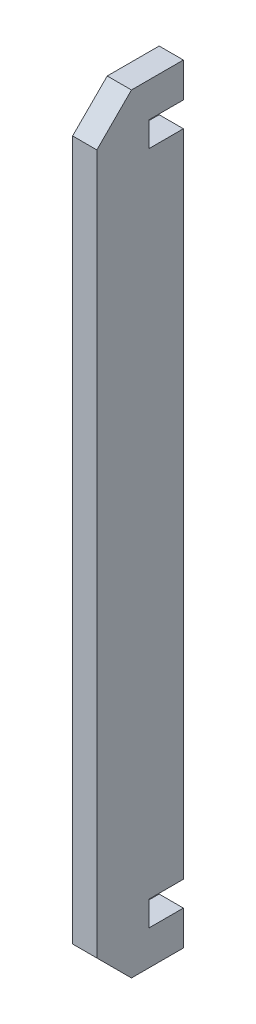
ISO-10303-21;
HEADER;
FILE_DESCRIPTION(('STEP AP214'),'2;1');
FILE_NAME('part.step','',(''),(''),'','','');
FILE_SCHEMA(('AUTOMOTIVE_DESIGN { 1 0 10303 214 1 1 1 1 }'));
ENDSEC;
DATA;
#1=APPLICATION_CONTEXT('core data for automotive mechanical design processes');
#2=APPLICATION_PROTOCOL_DEFINITION('international standard','automotive_design',2000,#1);
#3=PRODUCT_CONTEXT('',#1,'mechanical');
#4=PRODUCT('Part','Part','',(#3));
#5=PRODUCT_RELATED_PRODUCT_CATEGORY('part','',(#4));
#6=PRODUCT_DEFINITION_FORMATION('','',#4);
#7=PRODUCT_DEFINITION_CONTEXT('part definition',#1,'design');
#8=PRODUCT_DEFINITION('design','',#6,#7);
#9=PRODUCT_DEFINITION_SHAPE('','',#8);
#10=(LENGTH_UNIT() NAMED_UNIT(*) SI_UNIT(.MILLI.,.METRE.));
#11=(NAMED_UNIT(*) PLANE_ANGLE_UNIT() SI_UNIT($,.RADIAN.));
#12=(NAMED_UNIT(*) SI_UNIT($,.STERADIAN.) SOLID_ANGLE_UNIT());
#13=UNCERTAINTY_MEASURE_WITH_UNIT(LENGTH_MEASURE(1.E-05),#10,'distance_accuracy_value','');
#14=(GEOMETRIC_REPRESENTATION_CONTEXT(3) GLOBAL_UNCERTAINTY_ASSIGNED_CONTEXT((#13)) GLOBAL_UNIT_ASSIGNED_CONTEXT((#10,
#11,#12)) REPRESENTATION_CONTEXT('',''));
#15=CARTESIAN_POINT('',(0.,0.,0.));
#16=DIRECTION('',(0.,0.,1.));
#17=DIRECTION('',(1.,0.,0.));
#18=AXIS2_PLACEMENT_3D('',#15,#16,#17);
#19=CARTESIAN_POINT('',(3.5,0.,0.223880597014872));
#20=DIRECTION('',(0.,0.,1.));
#21=DIRECTION('',(0.,-1.,0.));
#22=AXIS2_PLACEMENT_3D('',#19,#20,#21);
#23=PLANE('',#22);
#24=DIRECTION('',(0.,1.,0.));
#25=VECTOR('',#24,1.);
#26=CARTESIAN_POINT('',(0.,0.,0.223880597014872));
#27=LINE('',#26,#25);
#28=CARTESIAN_POINT('',(0.,-17.9216417910448,0.223880597014868));
#29=VERTEX_POINT('',#28);
#30=CARTESIAN_POINT('',(0.,75.9783582089552,0.22388059701489));
#31=VERTEX_POINT('',#30);
#32=EDGE_CURVE('E178',#29,#31,#27,.T.);
#33=ORIENTED_EDGE('',*,*,#32,.T.);
#34=DIRECTION('',(-1.,0.,0.));
#35=VECTOR('',#34,1.);
#36=CARTESIAN_POINT('',(3.5,75.9783582089552,0.22388059701489));
#37=LINE('',#36,#35);
#38=CARTESIAN_POINT('',(3.5,75.9783582089552,0.22388059701489));
#39=VERTEX_POINT('',#38);
#40=EDGE_CURVE('E161',#39,#31,#37,.T.);
#41=ORIENTED_EDGE('',*,*,#40,.F.);
#42=DIRECTION('',(0.,1.,0.));
#43=VECTOR('',#42,1.);
#44=CARTESIAN_POINT('',(3.5,0.,0.223880597014872));
#45=LINE('',#44,#43);
#46=CARTESIAN_POINT('',(3.5,-17.9216417910448,0.223880597014868));
#47=VERTEX_POINT('',#46);
#48=EDGE_CURVE('E167',#47,#39,#45,.T.);
#49=ORIENTED_EDGE('',*,*,#48,.F.);
#50=DIRECTION('',(-1.,0.,0.));
#51=VECTOR('',#50,1.);
#52=CARTESIAN_POINT('',(3.5,-17.9216417910448,0.223880597014868));
#53=LINE('',#52,#51);
#54=EDGE_CURVE('E234',#47,#29,#53,.T.);
#55=ORIENTED_EDGE('',*,*,#54,.T.);
#56=EDGE_LOOP('',(#33,#41,#49,#55));
#57=FACE_BOUND('',#56,.T.);
#58=ADVANCED_FACE('F51',(#57),#23,.F.);
#59=CARTESIAN_POINT('',(3.5,75.9783582089552,0.));
#60=DIRECTION('',(0.,-1.,0.));
#61=DIRECTION('',(0.,0.,-1.));
#62=AXIS2_PLACEMENT_3D('',#59,#60,#61);
#63=PLANE('',#62);
#64=DIRECTION('',(0.,0.,1.));
#65=VECTOR('',#64,1.);
#66=CARTESIAN_POINT('',(0.,75.9783582089552,0.));
#67=LINE('',#66,#65);
#68=CARTESIAN_POINT('',(0.,75.9783582089552,5.22388059701566));
#69=VERTEX_POINT('',#68);
#70=EDGE_CURVE('E261',#31,#69,#67,.T.);
#71=ORIENTED_EDGE('',*,*,#70,.T.);
#72=DIRECTION('',(-1.,0.,0.));
#73=VECTOR('',#72,1.);
#74=CARTESIAN_POINT('',(3.5,75.9783582089552,5.22388059701566));
#75=LINE('',#74,#73);
#76=CARTESIAN_POINT('',(3.5,75.9783582089552,5.22388059701566));
#77=VERTEX_POINT('',#76);
#78=EDGE_CURVE('E164',#77,#69,#75,.T.);
#79=ORIENTED_EDGE('',*,*,#78,.F.);
#80=DIRECTION('',(0.,0.,1.));
#81=VECTOR('',#80,1.);
#82=CARTESIAN_POINT('',(3.5,75.9783582089552,0.));
#83=LINE('',#82,#81);
#84=EDGE_CURVE('E157',#39,#77,#83,.T.);
#85=ORIENTED_EDGE('',*,*,#84,.F.);
#86=ORIENTED_EDGE('',*,*,#40,.T.);
#87=EDGE_LOOP('',(#71,#79,#85,#86));
#88=FACE_BOUND('',#87,.T.);
#89=ADVANCED_FACE('F159',(#88),#63,.F.);
#90=CARTESIAN_POINT('',(3.5,0.,5.22388059701521));
#91=DIRECTION('',(0.,0.,1.));
#92=DIRECTION('',(0.,-1.,0.));
#93=AXIS2_PLACEMENT_3D('',#90,#91,#92);
#94=PLANE('',#93);
#95=DIRECTION('',(0.,1.,0.));
#96=VECTOR('',#95,1.);
#97=CARTESIAN_POINT('',(0.,0.,5.22388059701521));
#98=LINE('',#97,#96);
#99=CARTESIAN_POINT('',(0.,79.5783582089552,5.22388059701491));
#100=VERTEX_POINT('',#99);
#101=EDGE_CURVE('E259',#69,#100,#98,.T.);
#102=ORIENTED_EDGE('',*,*,#101,.T.);
#103=DIRECTION('',(-1.,0.,0.));
#104=VECTOR('',#103,1.);
#105=CARTESIAN_POINT('',(3.5,79.5783582089552,5.22388059701491));
#106=LINE('',#105,#104);
#107=CARTESIAN_POINT('',(3.5,79.5783582089552,5.22388059701491));
#108=VERTEX_POINT('',#107);
#109=EDGE_CURVE('E183',#108,#100,#106,.T.);
#110=ORIENTED_EDGE('',*,*,#109,.F.);
#111=DIRECTION('',(0.,1.,0.));
#112=VECTOR('',#111,1.);
#113=CARTESIAN_POINT('',(3.5,0.,5.22388059701521));
#114=LINE('',#113,#112);
#115=EDGE_CURVE('E166',#77,#108,#114,.T.);
#116=ORIENTED_EDGE('',*,*,#115,.F.);
#117=ORIENTED_EDGE('',*,*,#78,.T.);
#118=EDGE_LOOP('',(#102,#110,#116,#117));
#119=FACE_BOUND('',#118,.T.);
#120=ADVANCED_FACE('F260',(#119),#94,.F.);
#121=CARTESIAN_POINT('',(3.5,79.5783582089552,0.));
#122=DIRECTION('',(0.,-1.,0.));
#123=DIRECTION('',(0.,0.,-1.));
#124=AXIS2_PLACEMENT_3D('',#121,#122,#123);
#125=PLANE('',#124);
#126=DIRECTION('',(0.,0.,1.));
#127=VECTOR('',#126,1.);
#128=CARTESIAN_POINT('',(0.,79.5783582089552,0.));
#129=LINE('',#128,#127);
#130=CARTESIAN_POINT('',(0.,79.5783582089552,0.22388059701489));
#131=VERTEX_POINT('',#130);
#132=EDGE_CURVE('E222',#131,#100,#129,.T.);
#133=ORIENTED_EDGE('',*,*,#132,.F.);
#134=DIRECTION('',(-1.,0.,0.));
#135=VECTOR('',#134,1.);
#136=CARTESIAN_POINT('',(3.5,79.5783582089552,0.22388059701489));
#137=LINE('',#136,#135);
#138=CARTESIAN_POINT('',(3.5,79.5783582089552,0.22388059701489));
#139=VERTEX_POINT('',#138);
#140=EDGE_CURVE('E247',#139,#131,#137,.T.);
#141=ORIENTED_EDGE('',*,*,#140,.F.);
#142=DIRECTION('',(0.,0.,1.));
#143=VECTOR('',#142,1.);
#144=CARTESIAN_POINT('',(3.5,79.5783582089552,0.));
#145=LINE('',#144,#143);
#146=EDGE_CURVE('E256',#139,#108,#145,.T.);
#147=ORIENTED_EDGE('',*,*,#146,.T.);
#148=ORIENTED_EDGE('',*,*,#109,.T.);
#149=EDGE_LOOP('',(#133,#141,#147,#148));
#150=FACE_BOUND('',#149,.T.);
#151=ADVANCED_FACE('F253',(#150),#125,.T.);
#152=CARTESIAN_POINT('',(3.5,0.,0.223880597014872));
#153=DIRECTION('',(0.,0.,1.));
#154=DIRECTION('',(0.,-1.,0.));
#155=AXIS2_PLACEMENT_3D('',#152,#153,#154);
#156=PLANE('',#155);
#157=DIRECTION('',(0.,1.,0.));
#158=VECTOR('',#157,1.);
#159=CARTESIAN_POINT('',(0.,0.,0.223880597014872));
#160=LINE('',#159,#158);
#161=CARTESIAN_POINT('',(0.,84.5783582089552,0.223880597014892));
#162=VERTEX_POINT('',#161);
#163=EDGE_CURVE('E218',#131,#162,#160,.T.);
#164=ORIENTED_EDGE('',*,*,#163,.T.);
#165=DIRECTION('',(-1.,0.,0.));
#166=VECTOR('',#165,1.);
#167=CARTESIAN_POINT('',(3.5,84.5783582089552,0.223880597014892));
#168=LINE('',#167,#166);
#169=CARTESIAN_POINT('',(3.5,84.5783582089552,0.223880597014892));
#170=VERTEX_POINT('',#169);
#171=EDGE_CURVE('E217',#170,#162,#168,.T.);
#172=ORIENTED_EDGE('',*,*,#171,.F.);
#173=DIRECTION('',(0.,1.,0.));
#174=VECTOR('',#173,1.);
#175=CARTESIAN_POINT('',(3.5,0.,0.223880597014872));
#176=LINE('',#175,#174);
#177=EDGE_CURVE('E273',#139,#170,#176,.T.);
#178=ORIENTED_EDGE('',*,*,#177,.F.);
#179=ORIENTED_EDGE('',*,*,#140,.T.);
#180=EDGE_LOOP('',(#164,#172,#178,#179));
#181=FACE_BOUND('',#180,.T.);
#182=ADVANCED_FACE('F321',(#181),#156,.F.);
#183=CARTESIAN_POINT('',(3.5,84.5783582089552,0.));
#184=DIRECTION('',(0.,-1.,0.));
#185=DIRECTION('',(0.,0.,-1.));
#186=AXIS2_PLACEMENT_3D('',#183,#184,#185);
#187=PLANE('',#186);
#188=DIRECTION('',(0.,0.,1.));
#189=VECTOR('',#188,1.);
#190=CARTESIAN_POINT('',(0.,84.5783582089552,0.));
#191=LINE('',#190,#189);
#192=CARTESIAN_POINT('',(0.,84.5783582089552,7.72388059701494));
#193=VERTEX_POINT('',#192);
#194=EDGE_CURVE('E212',#162,#193,#191,.T.);
#195=ORIENTED_EDGE('',*,*,#194,.T.);
#196=DIRECTION('',(1.,0.,0.));
#197=VECTOR('',#196,1.);
#198=CARTESIAN_POINT('',(3.5,84.5783582089552,7.72388059701494));
#199=LINE('',#198,#197);
#200=CARTESIAN_POINT('',(3.5,84.5783582089552,7.72388059701494));
#201=VERTEX_POINT('',#200);
#202=EDGE_CURVE('E75',#193,#201,#199,.T.);
#203=ORIENTED_EDGE('',*,*,#202,.T.);
#204=DIRECTION('',(0.,0.,1.));
#205=VECTOR('',#204,1.);
#206=CARTESIAN_POINT('',(3.5,84.5783582089552,0.));
#207=LINE('',#206,#205);
#208=EDGE_CURVE('E197',#170,#201,#207,.T.);
#209=ORIENTED_EDGE('',*,*,#208,.F.);
#210=ORIENTED_EDGE('',*,*,#171,.T.);
#211=EDGE_LOOP('',(#195,#203,#209,#210));
#212=FACE_BOUND('',#211,.T.);
#213=ADVANCED_FACE('F215',(#212),#187,.F.);
#214=CARTESIAN_POINT('',(3.5,0.,12.7238805970149));
#215=DIRECTION('',(0.,0.,1.));
#216=DIRECTION('',(0.,-1.,0.));
#217=AXIS2_PLACEMENT_3D('',#214,#215,#216);
#218=PLANE('',#217);
#219=DIRECTION('',(0.,1.,0.));
#220=VECTOR('',#219,1.);
#221=CARTESIAN_POINT('',(3.5,0.,12.7238805970149));
#222=LINE('',#221,#220);
#223=CARTESIAN_POINT('',(3.5,-21.5216417910447,12.7238805970149));
#224=VERTEX_POINT('',#223);
#225=CARTESIAN_POINT('',(3.5,79.5783582089552,12.7238805970149));
#226=VERTEX_POINT('',#225);
#227=EDGE_CURVE('E196',#224,#226,#222,.T.);
#228=ORIENTED_EDGE('',*,*,#227,.T.);
#229=DIRECTION('',(-1.,0.,0.));
#230=VECTOR('',#229,1.);
#231=CARTESIAN_POINT('',(0.,79.5783582089552,12.7238805970149));
#232=LINE('',#231,#230);
#233=CARTESIAN_POINT('',(0.,79.5783582089552,12.7238805970149));
#234=VERTEX_POINT('',#233);
#235=EDGE_CURVE('E181',#226,#234,#232,.T.);
#236=ORIENTED_EDGE('',*,*,#235,.T.);
#237=DIRECTION('',(0.,1.,0.));
#238=VECTOR('',#237,1.);
#239=CARTESIAN_POINT('',(0.,0.,12.7238805970149));
#240=LINE('',#239,#238);
#241=CARTESIAN_POINT('',(0.,-21.5216417910447,12.7238805970149));
#242=VERTEX_POINT('',#241);
#243=EDGE_CURVE('E213',#242,#234,#240,.T.);
#244=ORIENTED_EDGE('',*,*,#243,.F.);
#245=DIRECTION('',(1.,0.,0.));
#246=VECTOR('',#245,1.);
#247=CARTESIAN_POINT('',(3.5,-21.5216417910447,12.7238805970149));
#248=LINE('',#247,#246);
#249=EDGE_CURVE('E179',#242,#224,#248,.T.);
#250=ORIENTED_EDGE('',*,*,#249,.T.);
#251=EDGE_LOOP('',(#228,#236,#244,#250));
#252=FACE_BOUND('',#251,.T.);
#253=ADVANCED_FACE('F201',(#252),#218,.T.);
#254=CARTESIAN_POINT('',(3.5,-26.5216417910448,0.));
#255=DIRECTION('',(0.,-1.,0.));
#256=DIRECTION('',(0.,0.,-1.));
#257=AXIS2_PLACEMENT_3D('',#254,#255,#256);
#258=PLANE('',#257);
#259=DIRECTION('',(0.,0.,1.));
#260=VECTOR('',#259,1.);
#261=CARTESIAN_POINT('',(3.5,-26.5216417910448,0.));
#262=LINE('',#261,#260);
#263=CARTESIAN_POINT('',(3.5,-26.5216417910448,0.223880597014866));
#264=VERTEX_POINT('',#263);
#265=CARTESIAN_POINT('',(3.5,-26.5216417910448,7.72388059701491));
#266=VERTEX_POINT('',#265);
#267=EDGE_CURVE('E205',#264,#266,#262,.T.);
#268=ORIENTED_EDGE('',*,*,#267,.T.);
#269=DIRECTION('',(-1.,0.,0.));
#270=VECTOR('',#269,1.);
#271=CARTESIAN_POINT('',(3.5,-26.5216417910448,7.72388059701491));
#272=LINE('',#271,#270);
#273=CARTESIAN_POINT('',(0.,-26.5216417910448,7.72388059701491));
#274=VERTEX_POINT('',#273);
#275=EDGE_CURVE('E11',#266,#274,#272,.T.);
#276=ORIENTED_EDGE('',*,*,#275,.T.);
#277=DIRECTION('',(0.,0.,1.));
#278=VECTOR('',#277,1.);
#279=CARTESIAN_POINT('',(0.,-26.5216417910448,0.));
#280=LINE('',#279,#278);
#281=CARTESIAN_POINT('',(0.,-26.5216417910448,0.223880597014866));
#282=VERTEX_POINT('',#281);
#283=EDGE_CURVE('E220',#282,#274,#280,.T.);
#284=ORIENTED_EDGE('',*,*,#283,.F.);
#285=DIRECTION('',(-1.,0.,0.));
#286=VECTOR('',#285,1.);
#287=CARTESIAN_POINT('',(3.5,-26.5216417910448,0.223880597014866));
#288=LINE('',#287,#286);
#289=EDGE_CURVE('E244',#264,#282,#288,.T.);
#290=ORIENTED_EDGE('',*,*,#289,.F.);
#291=EDGE_LOOP('',(#268,#276,#284,#290));
#292=FACE_BOUND('',#291,.T.);
#293=ADVANCED_FACE('F297',(#292),#258,.T.);
#294=CARTESIAN_POINT('',(0.,-21.5216417910448,0.223880597014867));
#295=VERTEX_POINT('',#294);
#296=EDGE_CURVE('E224',#282,#295,#160,.T.);
#297=ORIENTED_EDGE('',*,*,#296,.T.);
#298=DIRECTION('',(-1.,0.,0.));
#299=VECTOR('',#298,1.);
#300=CARTESIAN_POINT('',(3.5,-21.5216417910448,0.223880597014867));
#301=LINE('',#300,#299);
#302=CARTESIAN_POINT('',(3.5,-21.5216417910448,0.223880597014867));
#303=VERTEX_POINT('',#302);
#304=EDGE_CURVE('E241',#303,#295,#301,.T.);
#305=ORIENTED_EDGE('',*,*,#304,.F.);
#306=EDGE_CURVE('E270',#264,#303,#176,.T.);
#307=ORIENTED_EDGE('',*,*,#306,.F.);
#308=ORIENTED_EDGE('',*,*,#289,.T.);
#309=EDGE_LOOP('',(#297,#305,#307,#308));
#310=FACE_BOUND('',#309,.T.);
#311=ADVANCED_FACE('F295',(#310),#156,.F.);
#312=CARTESIAN_POINT('',(3.5,-21.5216417910448,0.));
#313=DIRECTION('',(0.,-1.,0.));
#314=DIRECTION('',(0.,0.,-1.));
#315=AXIS2_PLACEMENT_3D('',#312,#313,#314);
#316=PLANE('',#315);
#317=DIRECTION('',(0.,0.,1.));
#318=VECTOR('',#317,1.);
#319=CARTESIAN_POINT('',(0.,-21.5216417910448,0.));
#320=LINE('',#319,#318);
#321=CARTESIAN_POINT('',(0.,-21.5216417910448,5.22388059701487));
#322=VERTEX_POINT('',#321);
#323=EDGE_CURVE('E229',#295,#322,#320,.T.);
#324=ORIENTED_EDGE('',*,*,#323,.T.);
#325=DIRECTION('',(-1.,0.,0.));
#326=VECTOR('',#325,1.);
#327=CARTESIAN_POINT('',(3.5,-21.5216417910448,5.22388059701487));
#328=LINE('',#327,#326);
#329=CARTESIAN_POINT('',(3.5,-21.5216417910448,5.22388059701487));
#330=VERTEX_POINT('',#329);
#331=EDGE_CURVE('E238',#330,#322,#328,.T.);
#332=ORIENTED_EDGE('',*,*,#331,.F.);
#333=DIRECTION('',(0.,0.,1.));
#334=VECTOR('',#333,1.);
#335=CARTESIAN_POINT('',(3.5,-21.5216417910448,0.));
#336=LINE('',#335,#334);
#337=EDGE_CURVE('E268',#303,#330,#336,.T.);
#338=ORIENTED_EDGE('',*,*,#337,.F.);
#339=ORIENTED_EDGE('',*,*,#304,.T.);
#340=EDGE_LOOP('',(#324,#332,#338,#339));
#341=FACE_BOUND('',#340,.T.);
#342=ADVANCED_FACE('F291',(#341),#316,.F.);
#343=CARTESIAN_POINT('',(0.,-17.9216417910448,5.22388059701492));
#344=VERTEX_POINT('',#343);
#345=EDGE_CURVE('E231',#322,#344,#98,.T.);
#346=ORIENTED_EDGE('',*,*,#345,.T.);
#347=DIRECTION('',(-1.,0.,0.));
#348=VECTOR('',#347,1.);
#349=CARTESIAN_POINT('',(3.5,-17.9216417910448,5.22388059701492));
#350=LINE('',#349,#348);
#351=CARTESIAN_POINT('',(3.5,-17.9216417910448,5.22388059701492));
#352=VERTEX_POINT('',#351);
#353=EDGE_CURVE('E236',#352,#344,#350,.T.);
#354=ORIENTED_EDGE('',*,*,#353,.F.);
#355=EDGE_CURVE('E267',#330,#352,#114,.T.);
#356=ORIENTED_EDGE('',*,*,#355,.F.);
#357=ORIENTED_EDGE('',*,*,#331,.T.);
#358=EDGE_LOOP('',(#346,#354,#356,#357));
#359=FACE_BOUND('',#358,.T.);
#360=ADVANCED_FACE('F282',(#359),#94,.F.);
#361=CARTESIAN_POINT('',(3.5,-17.9216417910448,0.));
#362=DIRECTION('',(0.,-1.,0.));
#363=DIRECTION('',(0.,0.,-1.));
#364=AXIS2_PLACEMENT_3D('',#361,#362,#363);
#365=PLANE('',#364);
#366=DIRECTION('',(0.,0.,1.));
#367=VECTOR('',#366,1.);
#368=CARTESIAN_POINT('',(0.,-17.9216417910448,0.));
#369=LINE('',#368,#367);
#370=EDGE_CURVE('E175',#29,#344,#369,.T.);
#371=ORIENTED_EDGE('',*,*,#370,.F.);
#372=ORIENTED_EDGE('',*,*,#54,.F.);
#373=DIRECTION('',(0.,0.,1.));
#374=VECTOR('',#373,1.);
#375=CARTESIAN_POINT('',(3.5,-17.9216417910448,0.));
#376=LINE('',#375,#374);
#377=EDGE_CURVE('E173',#47,#352,#376,.T.);
#378=ORIENTED_EDGE('',*,*,#377,.T.);
#379=ORIENTED_EDGE('',*,*,#353,.T.);
#380=EDGE_LOOP('',(#371,#372,#378,#379));
#381=FACE_BOUND('',#380,.T.);
#382=ADVANCED_FACE('F286',(#381),#365,.T.);
#383=CARTESIAN_POINT('',(3.5,0.,0.));
#384=DIRECTION('',(1.,0.,0.));
#385=DIRECTION('',(0.,0.,-1.));
#386=AXIS2_PLACEMENT_3D('',#383,#384,#385);
#387=PLANE('',#386);
#388=ORIENTED_EDGE('',*,*,#208,.T.);
#389=DIRECTION('',(0.,-0.707106781186547,0.707106781186548));
#390=VECTOR('',#389,1.);
#391=CARTESIAN_POINT('',(3.5,46.1511194029851,46.1511194029851));
#392=LINE('',#391,#390);
#393=EDGE_CURVE('E60',#201,#226,#392,.T.);
#394=ORIENTED_EDGE('',*,*,#393,.T.);
#395=ORIENTED_EDGE('',*,*,#227,.F.);
#396=DIRECTION('',(0.,0.707106781186549,0.707106781186547));
#397=VECTOR('',#396,1.);
#398=CARTESIAN_POINT('',(3.5,-17.1227611940298,17.1227611940298));
#399=LINE('',#398,#397);
#400=EDGE_CURVE('E67',#224,#266,#399,.F.);
#401=ORIENTED_EDGE('',*,*,#400,.T.);
#402=ORIENTED_EDGE('',*,*,#267,.F.);
#403=ORIENTED_EDGE('',*,*,#306,.T.);
#404=ORIENTED_EDGE('',*,*,#337,.T.);
#405=ORIENTED_EDGE('',*,*,#355,.T.);
#406=ORIENTED_EDGE('',*,*,#377,.F.);
#407=ORIENTED_EDGE('',*,*,#48,.T.);
#408=ORIENTED_EDGE('',*,*,#84,.T.);
#409=ORIENTED_EDGE('',*,*,#115,.T.);
#410=ORIENTED_EDGE('',*,*,#146,.F.);
#411=ORIENTED_EDGE('',*,*,#177,.T.);
#412=EDGE_LOOP('',(#388,#394,#395,#401,#402,#403,#404,#405,#406,#407,#408,#409,#410,#411));
#413=FACE_BOUND('',#412,.T.);
#414=ADVANCED_FACE('F171',(#413),#387,.T.);
#415=CARTESIAN_POINT('',(0.,0.,0.));
#416=DIRECTION('',(1.,0.,0.));
#417=DIRECTION('',(0.,0.,-1.));
#418=AXIS2_PLACEMENT_3D('',#415,#416,#417);
#419=PLANE('',#418);
#420=ORIENTED_EDGE('',*,*,#243,.T.);
#421=DIRECTION('',(0.,0.707106781186547,-0.707106781186548));
#422=VECTOR('',#421,1.);
#423=CARTESIAN_POINT('',(0.,79.5783582089552,12.7238805970149));
#424=LINE('',#423,#422);
#425=EDGE_CURVE('E191',#234,#193,#424,.T.);
#426=ORIENTED_EDGE('',*,*,#425,.T.);
#427=ORIENTED_EDGE('',*,*,#194,.F.);
#428=ORIENTED_EDGE('',*,*,#163,.F.);
#429=ORIENTED_EDGE('',*,*,#132,.T.);
#430=ORIENTED_EDGE('',*,*,#101,.F.);
#431=ORIENTED_EDGE('',*,*,#70,.F.);
#432=ORIENTED_EDGE('',*,*,#32,.F.);
#433=ORIENTED_EDGE('',*,*,#370,.T.);
#434=ORIENTED_EDGE('',*,*,#345,.F.);
#435=ORIENTED_EDGE('',*,*,#323,.F.);
#436=ORIENTED_EDGE('',*,*,#296,.F.);
#437=ORIENTED_EDGE('',*,*,#283,.T.);
#438=DIRECTION('',(0.,-0.707106781186549,-0.707106781186547));
#439=VECTOR('',#438,1.);
#440=CARTESIAN_POINT('',(0.,-26.5216417910448,7.72388059701491));
#441=LINE('',#440,#439);
#442=EDGE_CURVE('E189',#274,#242,#441,.F.);
#443=ORIENTED_EDGE('',*,*,#442,.T.);
#444=EDGE_LOOP('',(#420,#426,#427,#428,#429,#430,#431,#432,#433,#434,#435,#436,#437,#443));
#445=FACE_BOUND('',#444,.T.);
#446=ADVANCED_FACE('F210',(#445),#419,.F.);
#447=CARTESIAN_POINT('',(3.5,79.5783582089552,12.7238805970149));
#448=DIRECTION('',(0.,0.707106781186548,0.707106781186547));
#449=DIRECTION('',(1.,0.,0.));
#450=AXIS2_PLACEMENT_3D('',#447,#448,#449);
#451=PLANE('',#450);
#452=ORIENTED_EDGE('',*,*,#393,.F.);
#453=ORIENTED_EDGE('',*,*,#202,.F.);
#454=ORIENTED_EDGE('',*,*,#425,.F.);
#455=ORIENTED_EDGE('',*,*,#235,.F.);
#456=EDGE_LOOP('',(#452,#453,#454,#455));
#457=FACE_BOUND('',#456,.T.);
#458=ADVANCED_FACE('F207',(#457),#451,.T.);
#459=CARTESIAN_POINT('',(3.5,-26.5216417910448,7.72388059701491));
#460=DIRECTION('',(0.,0.707106781186546,-0.707106781186548));
#461=DIRECTION('',(-1.,0.,0.));
#462=AXIS2_PLACEMENT_3D('',#459,#460,#461);
#463=PLANE('',#462);
#464=ORIENTED_EDGE('',*,*,#400,.F.);
#465=ORIENTED_EDGE('',*,*,#249,.F.);
#466=ORIENTED_EDGE('',*,*,#442,.F.);
#467=ORIENTED_EDGE('',*,*,#275,.F.);
#468=EDGE_LOOP('',(#464,#465,#466,#467));
#469=FACE_BOUND('',#468,.T.);
#470=ADVANCED_FACE('F54',(#469),#463,.F.);
#471=CLOSED_SHELL('',(#58,#89,#120,#151,#182,#213,#253,#293,#311,#342,#360,#382,#414,#446,#458,#470));
#472=MANIFOLD_SOLID_BREP('B2',#471);
#473=ADVANCED_BREP_SHAPE_REPRESENTATION('',(#18,#472),#14);
#474=SHAPE_DEFINITION_REPRESENTATION(#9,#473);
ENDSEC;
END-ISO-10303-21;
